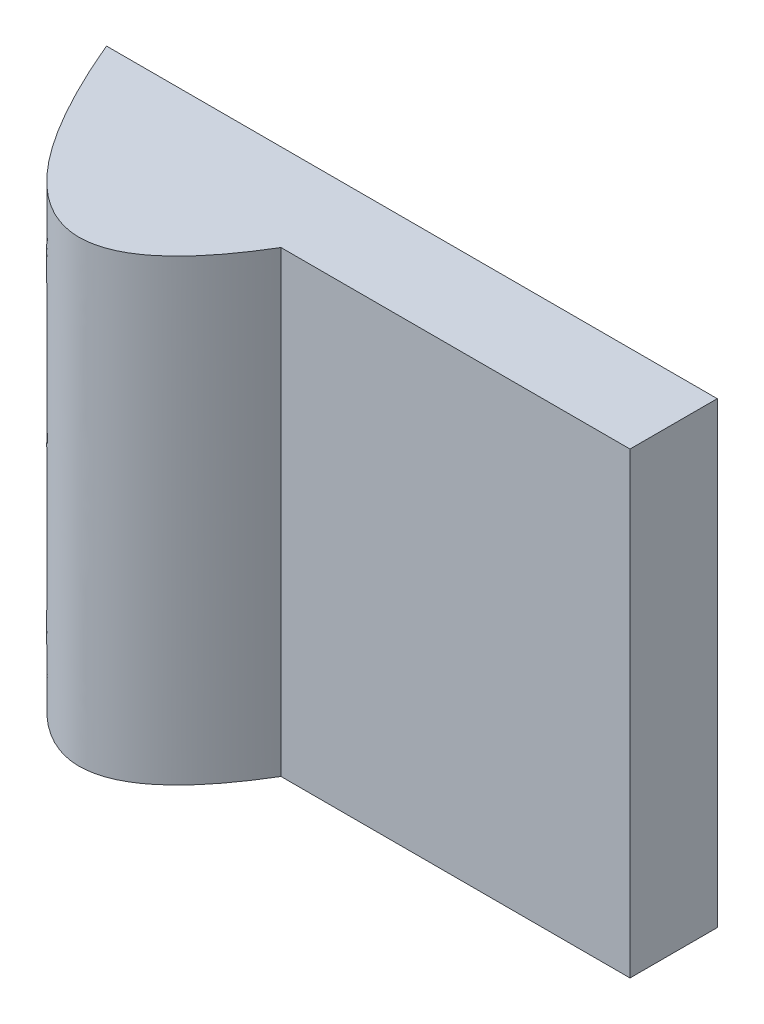
ISO-10303-21;
HEADER;
FILE_DESCRIPTION(('STEP AP214'),'2;1');
FILE_NAME('part.step','',(''),(''),'','','');
FILE_SCHEMA(('AUTOMOTIVE_DESIGN { 1 0 10303 214 1 1 1 1 }'));
ENDSEC;
DATA;
#1=APPLICATION_CONTEXT('core data for automotive mechanical design processes');
#2=APPLICATION_PROTOCOL_DEFINITION('international standard','automotive_design',2000,#1);
#3=PRODUCT_CONTEXT('',#1,'mechanical');
#4=PRODUCT('Part','Part','',(#3));
#5=PRODUCT_RELATED_PRODUCT_CATEGORY('part','',(#4));
#6=PRODUCT_DEFINITION_FORMATION('','',#4);
#7=PRODUCT_DEFINITION_CONTEXT('part definition',#1,'design');
#8=PRODUCT_DEFINITION('design','',#6,#7);
#9=PRODUCT_DEFINITION_SHAPE('','',#8);
#10=(LENGTH_UNIT() NAMED_UNIT(*) SI_UNIT(.MILLI.,.METRE.));
#11=(NAMED_UNIT(*) PLANE_ANGLE_UNIT() SI_UNIT($,.RADIAN.));
#12=(NAMED_UNIT(*) SI_UNIT($,.STERADIAN.) SOLID_ANGLE_UNIT());
#13=UNCERTAINTY_MEASURE_WITH_UNIT(LENGTH_MEASURE(1.E-05),#10,'distance_accuracy_value','');
#14=(GEOMETRIC_REPRESENTATION_CONTEXT(3) GLOBAL_UNCERTAINTY_ASSIGNED_CONTEXT((#13)) GLOBAL_UNIT_ASSIGNED_CONTEXT((#10,
#11,#12)) REPRESENTATION_CONTEXT('',''));
#15=CARTESIAN_POINT('',(0.,0.,0.));
#16=DIRECTION('',(0.,0.,1.));
#17=DIRECTION('',(1.,0.,0.));
#18=AXIS2_PLACEMENT_3D('',#15,#16,#17);
#19=CARTESIAN_POINT('',(0.,105.,-70.));
#20=DIRECTION('',(0.,0.,-1.));
#21=DIRECTION('',(-1.,0.,0.));
#22=AXIS2_PLACEMENT_3D('',#19,#20,#21);
#23=PLANE('',#22);
#24=DIRECTION('',(1.,0.,0.));
#25=VECTOR('',#24,1.);
#26=CARTESIAN_POINT('',(0.,0.,-70.));
#27=LINE('',#26,#25);
#28=CARTESIAN_POINT('',(59.9999999999999,0.,-70.));
#29=VERTEX_POINT('',#28);
#30=CARTESIAN_POINT('',(200.,0.,-70.));
#31=VERTEX_POINT('',#30);
#32=EDGE_CURVE('E227',#29,#31,#27,.T.);
#33=ORIENTED_EDGE('',*,*,#32,.F.);
#34=DIRECTION('',(0.,-1.,0.));
#35=VECTOR('',#34,1.);
#36=CARTESIAN_POINT('',(59.9999999999999,105.,-70.));
#37=LINE('',#36,#35);
#38=CARTESIAN_POINT('',(59.9999999999999,105.,-70.));
#39=VERTEX_POINT('',#38);
#40=EDGE_CURVE('E11',#39,#29,#37,.T.);
#41=ORIENTED_EDGE('',*,*,#40,.F.);
#42=DIRECTION('',(1.,0.,0.));
#43=VECTOR('',#42,1.);
#44=CARTESIAN_POINT('',(0.,105.,-70.));
#45=LINE('',#44,#43);
#46=CARTESIAN_POINT('',(200.,105.,-70.));
#47=VERTEX_POINT('',#46);
#48=EDGE_CURVE('E188',#39,#47,#45,.T.);
#49=ORIENTED_EDGE('',*,*,#48,.T.);
#50=DIRECTION('',(0.,-1.,0.));
#51=VECTOR('',#50,1.);
#52=CARTESIAN_POINT('',(200.,105.,-70.));
#53=LINE('',#52,#51);
#54=EDGE_CURVE('E70',#47,#31,#53,.T.);
#55=ORIENTED_EDGE('',*,*,#54,.T.);
#56=EDGE_LOOP('',(#33,#41,#49,#55));
#57=FACE_BOUND('',#56,.T.);
#58=ADVANCED_FACE('F41',(#57),#23,.T.);
#59=CARTESIAN_POINT('',(59.9999999999999,105.,-70.));
#60=CARTESIAN_POINT('',(89.7639468296247,105.,0.562785514085895));
#61=CARTESIAN_POINT('',(120.,105.,-50.));
#62=B_SPLINE_CURVE_WITH_KNOTS('',2,(#59,#60,#61),.UNSPECIFIED.,.F.,.F.,(3,3),(0.,1.),.UNSPECIFIED.);
#63=DIRECTION('',(0.,-1.,0.));
#64=VECTOR('',#63,1.);
#65=SURFACE_OF_LINEAR_EXTRUSION('',#62,#64);
#66=CARTESIAN_POINT('',(59.9999999999999,0.,-70.));
#67=CARTESIAN_POINT('',(89.7639468296247,0.,0.562785514085895));
#68=CARTESIAN_POINT('',(120.,0.,-50.));
#69=B_SPLINE_CURVE_WITH_KNOTS('',2,(#66,#67,#68),.UNSPECIFIED.,.F.,.F.,(3,3),(0.,1.),.UNSPECIFIED.);
#70=CARTESIAN_POINT('',(120.,0.,-50.));
#71=VERTEX_POINT('',#70);
#72=EDGE_CURVE('E231',#29,#71,#69,.T.);
#73=ORIENTED_EDGE('',*,*,#72,.T.);
#74=DIRECTION('',(0.,-1.,0.));
#75=VECTOR('',#74,1.);
#76=CARTESIAN_POINT('',(120.,105.,-50.));
#77=LINE('',#76,#75);
#78=CARTESIAN_POINT('',(120.,105.,-50.));
#79=VERTEX_POINT('',#78);
#80=EDGE_CURVE('E52',#79,#71,#77,.T.);
#81=ORIENTED_EDGE('',*,*,#80,.F.);
#82=EDGE_CURVE('E191',#39,#79,#62,.T.);
#83=ORIENTED_EDGE('',*,*,#82,.F.);
#84=ORIENTED_EDGE('',*,*,#40,.T.);
#85=EDGE_LOOP('',(#73,#81,#83,#84));
#86=FACE_BOUND('',#85,.T.);
#87=ADVANCED_FACE('F203',(#86),#65,.F.);
#88=CARTESIAN_POINT('',(0.,105.,-50.));
#89=DIRECTION('',(0.,0.,1.));
#90=DIRECTION('',(1.,0.,0.));
#91=AXIS2_PLACEMENT_3D('',#88,#89,#90);
#92=PLANE('',#91);
#93=DIRECTION('',(-1.,0.,0.));
#94=VECTOR('',#93,1.);
#95=CARTESIAN_POINT('',(0.,0.,-50.));
#96=LINE('',#95,#94);
#97=CARTESIAN_POINT('',(200.,0.,-50.));
#98=VERTEX_POINT('',#97);
#99=EDGE_CURVE('E237',#98,#71,#96,.T.);
#100=ORIENTED_EDGE('',*,*,#99,.F.);
#101=DIRECTION('',(0.,-1.,0.));
#102=VECTOR('',#101,1.);
#103=CARTESIAN_POINT('',(200.,105.,-50.));
#104=LINE('',#103,#102);
#105=CARTESIAN_POINT('',(200.,105.,-50.));
#106=VERTEX_POINT('',#105);
#107=EDGE_CURVE('E254',#106,#98,#104,.T.);
#108=ORIENTED_EDGE('',*,*,#107,.F.);
#109=DIRECTION('',(-1.,0.,0.));
#110=VECTOR('',#109,1.);
#111=CARTESIAN_POINT('',(0.,105.,-50.));
#112=LINE('',#111,#110);
#113=EDGE_CURVE('E198',#106,#79,#112,.T.);
#114=ORIENTED_EDGE('',*,*,#113,.T.);
#115=ORIENTED_EDGE('',*,*,#80,.T.);
#116=EDGE_LOOP('',(#100,#108,#114,#115));
#117=FACE_BOUND('',#116,.T.);
#118=ADVANCED_FACE('F206',(#117),#92,.T.);
#119=CARTESIAN_POINT('',(200.,105.,0.));
#120=DIRECTION('',(1.,0.,0.));
#121=DIRECTION('',(0.,0.,-1.));
#122=AXIS2_PLACEMENT_3D('',#119,#120,#121);
#123=PLANE('',#122);
#124=DIRECTION('',(0.,0.,1.));
#125=VECTOR('',#124,1.);
#126=CARTESIAN_POINT('',(200.,0.,0.));
#127=LINE('',#126,#125);
#128=EDGE_CURVE('E192',#31,#98,#127,.T.);
#129=ORIENTED_EDGE('',*,*,#128,.F.);
#130=ORIENTED_EDGE('',*,*,#54,.F.);
#131=DIRECTION('',(0.,0.,1.));
#132=VECTOR('',#131,1.);
#133=CARTESIAN_POINT('',(200.,105.,0.));
#134=LINE('',#133,#132);
#135=EDGE_CURVE('E240',#47,#106,#134,.T.);
#136=ORIENTED_EDGE('',*,*,#135,.T.);
#137=ORIENTED_EDGE('',*,*,#107,.T.);
#138=EDGE_LOOP('',(#129,#130,#136,#137));
#139=FACE_BOUND('',#138,.T.);
#140=ADVANCED_FACE('F210',(#139),#123,.T.);
#141=CARTESIAN_POINT('',(0.,105.,0.));
#142=DIRECTION('',(0.,1.,0.));
#143=DIRECTION('',(0.,0.,1.));
#144=AXIS2_PLACEMENT_3D('',#141,#142,#143);
#145=PLANE('',#144);
#146=ORIENTED_EDGE('',*,*,#48,.F.);
#147=ORIENTED_EDGE('',*,*,#82,.T.);
#148=ORIENTED_EDGE('',*,*,#113,.F.);
#149=ORIENTED_EDGE('',*,*,#135,.F.);
#150=EDGE_LOOP('',(#146,#147,#148,#149));
#151=FACE_BOUND('',#150,.T.);
#152=ADVANCED_FACE('F213',(#151),#145,.T.);
#153=CARTESIAN_POINT('',(0.,0.,0.));
#154=DIRECTION('',(0.,1.,0.));
#155=DIRECTION('',(0.,0.,1.));
#156=AXIS2_PLACEMENT_3D('',#153,#154,#155);
#157=PLANE('',#156);
#158=DIRECTION('',(1.,0.,-2.10641765325667E-13));
#159=VECTOR('',#158,1.);
#160=CARTESIAN_POINT('',(118.571731581544,0.,-52.4999999999833));
#161=LINE('',#160,#159);
#162=CARTESIAN_POINT('',(118.571731581532,0.,-52.4999999999913));
#163=VERTEX_POINT('',#162);
#164=CARTESIAN_POINT('',(197.5,0.,-52.5));
#165=VERTEX_POINT('',#164);
#166=EDGE_CURVE('E128',#163,#165,#161,.T.);
#167=ORIENTED_EDGE('',*,*,#166,.T.);
#168=DIRECTION('',(0.,0.,-1.));
#169=VECTOR('',#168,1.);
#170=CARTESIAN_POINT('',(197.5,0.,-52.5));
#171=LINE('',#170,#169);
#172=CARTESIAN_POINT('',(197.5,0.,-67.5));
#173=VERTEX_POINT('',#172);
#174=EDGE_CURVE('E119',#165,#173,#171,.T.);
#175=ORIENTED_EDGE('',*,*,#174,.T.);
#176=DIRECTION('',(-1.,0.,0.));
#177=VECTOR('',#176,1.);
#178=CARTESIAN_POINT('',(197.5,0.,-67.5));
#179=LINE('',#178,#177);
#180=CARTESIAN_POINT('',(63.8007796486189,0.,-67.4999999999995));
#181=VERTEX_POINT('',#180);
#182=EDGE_CURVE('E131',#173,#181,#179,.T.);
#183=ORIENTED_EDGE('',*,*,#182,.T.);
#184=CARTESIAN_POINT('',(118.571731581532,0.,-52.4999999999913));
#185=CARTESIAN_POINT('',(117.700689072234,0.,-51.0013659075484));
#186=CARTESIAN_POINT('',(116.797531301888,0.,-49.5232047280209));
#187=CARTESIAN_POINT('',(114.908562721405,0.,-46.6195722251489));
#188=CARTESIAN_POINT('',(113.920848072441,0.,-45.191271588309));
#189=CARTESIAN_POINT('',(111.847843607642,0.,-42.4238551953792));
#190=CARTESIAN_POINT('',(110.762764430003,0.,-41.0837436654712));
#191=CARTESIAN_POINT('',(108.455990570882,0.,-38.5261298091099));
#192=CARTESIAN_POINT('',(107.235485200437,0.,-37.3075601039551));
#193=CARTESIAN_POINT('',(105.577699644215,0.,-35.9029529404592));
#194=CARTESIAN_POINT('',(105.238639259198,0.,-35.6275599185483));
#195=CARTESIAN_POINT('',(104.550679955083,0.,-35.0949941671792));
#196=CARTESIAN_POINT('',(104.201442555354,0.,-34.8374813269087));
#197=CARTESIAN_POINT('',(103.136178711405,0.,-34.0942193244457));
#198=CARTESIAN_POINT('',(102.402774126846,0.,-33.6374572715118));
#199=CARTESIAN_POINT('',(101.258207725243,0.,-33.0264736290222));
#200=CARTESIAN_POINT('',(100.86923742211,0.,-32.8352361202778));
#201=CARTESIAN_POINT('',(100.074177189102,0.,-32.4813170058469));
#202=CARTESIAN_POINT('',(99.6661939366149,0.,-32.318036142523));
#203=CARTESIAN_POINT('',(98.4310313274661,0.,-31.8841739025251));
#204=CARTESIAN_POINT('',(97.5914115130016,0.,-31.6681420071057));
#205=CARTESIAN_POINT('',(96.3036988695407,0.,-31.4720810428203));
#206=CARTESIAN_POINT('',(95.8691192852659,0.,-31.4280646251062));
#207=CARTESIAN_POINT('',(94.9923433063451,0.,-31.3862265177101));
#208=CARTESIAN_POINT('',(94.5567845764144,0.,-31.388668969988));
#209=CARTESIAN_POINT('',(93.2582870437722,0.,-31.4635283950751));
#210=CARTESIAN_POINT('',(92.4035308194527,0.,-31.6035098143176));
#211=CARTESIAN_POINT('',(91.1363690074252,0.,-31.9371117182441));
#212=CARTESIAN_POINT('',(90.7171674861406,0.,-32.0689844590564));
#213=CARTESIAN_POINT('',(89.9011279966838,0.,-32.364288721269));
#214=CARTESIAN_POINT('',(89.5018252306602,0.,-32.5283130391553));
#215=CARTESIAN_POINT('',(88.3267309185229,0.,-33.0632351097313));
#216=CARTESIAN_POINT('',(87.5736003318513,0.,-33.4766945656551));
#217=CARTESIAN_POINT('',(86.114894928821,0.,-34.3929324928798));
#218=CARTESIAN_POINT('',(85.4075274457681,0.,-34.8973321217045));
#219=CARTESIAN_POINT('',(84.0400386303843,0.,-35.9724439482684));
#220=CARTESIAN_POINT('',(83.3842160470672,0.,-36.5393965587148));
#221=CARTESIAN_POINT('',(82.1163539797221,0.,-37.7193975680936));
#222=CARTESIAN_POINT('',(81.5043848447922,0.,-38.3325200320697));
#223=CARTESIAN_POINT('',(80.3161767981669,0.,-39.5963825074271));
#224=CARTESIAN_POINT('',(79.7389025536571,0.,-40.2485391840518));
#225=CARTESIAN_POINT('',(78.0663360240674,0.,-42.2345746306917));
#226=CARTESIAN_POINT('',(77.0249010291279,0.,-43.601867811771));
#227=CARTESIAN_POINT('',(75.0438003313227,0.,-46.3962768863662));
#228=CARTESIAN_POINT('',(74.1046403958391,0.,-47.8236900834793));
#229=CARTESIAN_POINT('',(71.4022288268472,0.,-52.1735698632781));
#230=CARTESIAN_POINT('',(69.7521328059089,0.,-55.1625523422327));
#231=CARTESIAN_POINT('',(66.644103155749,0.,-61.2534754948678));
#232=CARTESIAN_POINT('',(65.1878369101097,0.,-64.3563963012252));
#233=CARTESIAN_POINT('',(63.8007796486189,0.,-67.4999999999995));
#234=B_SPLINE_CURVE_WITH_KNOTS('',3,(#184,#185,#186,#187,#188,#189,#190,#191,#192,#193,#194,
#195,#196,#197,#198,#199,#200,#201,#202,#203,#204,#205,#206,#207,#208,#209,#210,#211,#212,#213,
#214,#215,#216,#217,#218,#219,#220,#221,#222,#223,#224,#225,#226,#227,#228,#229,#230,#231,#232,
#233),.UNSPECIFIED.,.F.,.F.,(4,2,2,2,2,2,2,2,2,2,2,2,2,2,2,2,2,2,2,2,2,2,2,2,4),(0.,
0.0624999999999992,0.124999999999998,0.187499999999998,0.249999999999997,0.265624999999997,
0.281249999999996,0.312499999999996,0.328124999999996,0.343749999999995,0.374999999999995,
0.390624999999995,0.406249999999995,0.437499999999994,0.453124999999994,0.468749999999995,
0.499999999999995,0.531249999999995,0.562499999999995,0.593749999999996,0.624999999999996,
0.687499999999996,0.749999999999997,0.874999999999999,1.),.UNSPECIFIED.);
#235=EDGE_CURVE('E60',#181,#163,#234,.F.);
#236=ORIENTED_EDGE('',*,*,#235,.T.);
#237=EDGE_LOOP('',(#167,#175,#183,#236));
#238=FACE_BOUND('',#237,.T.);
#239=ORIENTED_EDGE('',*,*,#32,.T.);
#240=ORIENTED_EDGE('',*,*,#128,.T.);
#241=ORIENTED_EDGE('',*,*,#99,.T.);
#242=ORIENTED_EDGE('',*,*,#72,.F.);
#243=EDGE_LOOP('',(#239,#240,#241,#242));
#244=FACE_BOUND('',#243,.T.);
#245=ADVANCED_FACE('F136',(#238,#244),#157,.F.);
#246=CARTESIAN_POINT('',(197.5,0.,-52.5));
#247=DIRECTION('',(1.,0.,0.));
#248=DIRECTION('',(0.,0.,-1.));
#249=AXIS2_PLACEMENT_3D('',#246,#247,#248);
#250=PLANE('',#249);
#251=DIRECTION('',(0.,0.,-1.));
#252=VECTOR('',#251,1.);
#253=CARTESIAN_POINT('',(197.5,102.5,-52.5));
#254=LINE('',#253,#252);
#255=CARTESIAN_POINT('',(197.5,102.5,-52.5));
#256=VERTEX_POINT('',#255);
#257=CARTESIAN_POINT('',(197.5,102.5,-67.5));
#258=VERTEX_POINT('',#257);
#259=EDGE_CURVE('E122',#256,#258,#254,.T.);
#260=ORIENTED_EDGE('',*,*,#259,.T.);
#261=DIRECTION('',(0.,1.,0.));
#262=VECTOR('',#261,1.);
#263=CARTESIAN_POINT('',(197.5,0.,-67.5));
#264=LINE('',#263,#262);
#265=EDGE_CURVE('E115',#173,#258,#264,.T.);
#266=ORIENTED_EDGE('',*,*,#265,.F.);
#267=ORIENTED_EDGE('',*,*,#174,.F.);
#268=DIRECTION('',(0.,1.,0.));
#269=VECTOR('',#268,1.);
#270=CARTESIAN_POINT('',(197.5,0.,-52.5));
#271=LINE('',#270,#269);
#272=EDGE_CURVE('E232',#165,#256,#271,.T.);
#273=ORIENTED_EDGE('',*,*,#272,.T.);
#274=EDGE_LOOP('',(#260,#266,#267,#273));
#275=FACE_BOUND('',#274,.T.);
#276=ADVANCED_FACE('F117',(#275),#250,.F.);
#277=CARTESIAN_POINT('',(118.571731581544,0.,-52.4999999999833));
#278=DIRECTION('',(2.10641765325667E-13,0.,1.));
#279=DIRECTION('',(1.,0.,-2.10641765325667E-13));
#280=AXIS2_PLACEMENT_3D('',#277,#278,#279);
#281=PLANE('',#280);
#282=DIRECTION('',(1.,0.,-2.10641765325667E-13));
#283=VECTOR('',#282,1.);
#284=CARTESIAN_POINT('',(118.571731581544,102.5,-52.4999999999833));
#285=LINE('',#284,#283);
#286=CARTESIAN_POINT('',(118.571731581532,102.5,-52.4999999999913));
#287=VERTEX_POINT('',#286);
#288=EDGE_CURVE('E140',#287,#256,#285,.T.);
#289=ORIENTED_EDGE('',*,*,#288,.T.);
#290=ORIENTED_EDGE('',*,*,#272,.F.);
#291=ORIENTED_EDGE('',*,*,#166,.F.);
#292=DIRECTION('',(0.,1.,0.));
#293=VECTOR('',#292,1.);
#294=CARTESIAN_POINT('',(118.571731581532,0.,-52.4999999999913));
#295=LINE('',#294,#293);
#296=EDGE_CURVE('E239',#163,#287,#295,.T.);
#297=ORIENTED_EDGE('',*,*,#296,.T.);
#298=EDGE_LOOP('',(#289,#290,#291,#297));
#299=FACE_BOUND('',#298,.T.);
#300=ADVANCED_FACE('F161',(#299),#281,.F.);
#301=CARTESIAN_POINT('',(63.8007796486189,0.,-67.4999999999995));
#302=CARTESIAN_POINT('',(65.1878369101097,0.,-64.3563963012252));
#303=CARTESIAN_POINT('',(66.644103155749,0.,-61.2534754948678));
#304=CARTESIAN_POINT('',(69.7521328059089,0.,-55.1625523422327));
#305=CARTESIAN_POINT('',(71.4022288268472,0.,-52.1735698632781));
#306=CARTESIAN_POINT('',(74.1046403958391,0.,-47.8236900834793));
#307=CARTESIAN_POINT('',(75.0438003313227,0.,-46.3962768863662));
#308=CARTESIAN_POINT('',(77.0249010291279,0.,-43.601867811771));
#309=CARTESIAN_POINT('',(78.0663360240674,0.,-42.2345746306917));
#310=CARTESIAN_POINT('',(79.7389025536571,0.,-40.2485391840518));
#311=CARTESIAN_POINT('',(80.3161767981669,0.,-39.5963825074271));
#312=CARTESIAN_POINT('',(81.5043848447922,0.,-38.3325200320697));
#313=CARTESIAN_POINT('',(82.1163539797221,0.,-37.7193975680936));
#314=CARTESIAN_POINT('',(83.3842160470672,0.,-36.5393965587148));
#315=CARTESIAN_POINT('',(84.0400386303843,0.,-35.9724439482684));
#316=CARTESIAN_POINT('',(85.4075274457681,0.,-34.8973321217045));
#317=CARTESIAN_POINT('',(86.114894928821,0.,-34.3929324928798));
#318=CARTESIAN_POINT('',(87.5736003318513,0.,-33.4766945656551));
#319=CARTESIAN_POINT('',(88.3267309185229,0.,-33.0632351097313));
#320=CARTESIAN_POINT('',(89.5018252306602,0.,-32.5283130391553));
#321=CARTESIAN_POINT('',(89.9011279966838,0.,-32.364288721269));
#322=CARTESIAN_POINT('',(90.7171674861406,0.,-32.0689844590564));
#323=CARTESIAN_POINT('',(91.1363690074252,0.,-31.9371117182441));
#324=CARTESIAN_POINT('',(92.4035308194527,0.,-31.6035098143176));
#325=CARTESIAN_POINT('',(93.2582870437722,0.,-31.4635283950751));
#326=CARTESIAN_POINT('',(94.5567845764144,0.,-31.388668969988));
#327=CARTESIAN_POINT('',(94.9923433063451,0.,-31.3862265177101));
#328=CARTESIAN_POINT('',(95.8691192852659,0.,-31.4280646251062));
#329=CARTESIAN_POINT('',(96.3036988695407,0.,-31.4720810428203));
#330=CARTESIAN_POINT('',(97.5914115130016,0.,-31.6681420071057));
#331=CARTESIAN_POINT('',(98.4310313274661,0.,-31.8841739025251));
#332=CARTESIAN_POINT('',(99.6661939366149,0.,-32.318036142523));
#333=CARTESIAN_POINT('',(100.074177189102,0.,-32.4813170058469));
#334=CARTESIAN_POINT('',(100.86923742211,0.,-32.8352361202778));
#335=CARTESIAN_POINT('',(101.258207725243,0.,-33.0264736290222));
#336=CARTESIAN_POINT('',(102.402774126846,0.,-33.6374572715118));
#337=CARTESIAN_POINT('',(103.136178711405,0.,-34.0942193244457));
#338=CARTESIAN_POINT('',(104.201442555354,0.,-34.8374813269087));
#339=CARTESIAN_POINT('',(104.550679955083,0.,-35.0949941671792));
#340=CARTESIAN_POINT('',(105.238639259198,0.,-35.6275599185483));
#341=CARTESIAN_POINT('',(105.577699644215,0.,-35.9029529404592));
#342=CARTESIAN_POINT('',(107.235485200437,0.,-37.3075601039551));
#343=CARTESIAN_POINT('',(108.455990570882,0.,-38.5261298091099));
#344=CARTESIAN_POINT('',(110.762764430003,0.,-41.0837436654712));
#345=CARTESIAN_POINT('',(111.847843607642,0.,-42.4238551953792));
#346=CARTESIAN_POINT('',(113.920848072441,0.,-45.191271588309));
#347=CARTESIAN_POINT('',(114.908562721405,0.,-46.6195722251489));
#348=CARTESIAN_POINT('',(116.797531301888,0.,-49.5232047280209));
#349=CARTESIAN_POINT('',(117.700689072234,0.,-51.0013659075484));
#350=CARTESIAN_POINT('',(118.571731581532,0.,-52.4999999999913));
#351=B_SPLINE_CURVE_WITH_KNOTS('',3,(#301,#302,#303,#304,#305,#306,#307,#308,#309,#310,#311,
#312,#313,#314,#315,#316,#317,#318,#319,#320,#321,#322,#323,#324,#325,#326,#327,#328,#329,#330,
#331,#332,#333,#334,#335,#336,#337,#338,#339,#340,#341,#342,#343,#344,#345,#346,#347,#348,#349,
#350),.UNSPECIFIED.,.F.,.F.,(4,2,2,2,2,2,2,2,2,2,2,2,2,2,2,2,2,2,2,2,2,2,2,2,4),(0.,
0.125000000000001,0.250000000000003,0.312500000000004,0.375000000000004,0.406250000000004,
0.437500000000005,0.468750000000005,0.500000000000005,0.531250000000005,0.546875000000006,
0.562500000000006,0.593750000000005,0.609375000000005,0.625000000000005,0.656250000000005,
0.671875000000004,0.687500000000004,0.718750000000004,0.734375000000003,0.750000000000003,
0.812500000000002,0.875000000000002,0.937500000000001,1.),.UNSPECIFIED.);
#352=DIRECTION('',(0.,1.,0.));
#353=VECTOR('',#352,1.);
#354=SURFACE_OF_LINEAR_EXTRUSION('',#351,#353);
#355=CARTESIAN_POINT('',(63.8007796486189,102.5,-67.4999999999995));
#356=CARTESIAN_POINT('',(65.1878369101097,102.5,-64.3563963012252));
#357=CARTESIAN_POINT('',(66.644103155749,102.5,-61.2534754948678));
#358=CARTESIAN_POINT('',(69.7521328059089,102.5,-55.1625523422327));
#359=CARTESIAN_POINT('',(71.4022288268472,102.5,-52.1735698632781));
#360=CARTESIAN_POINT('',(74.1046403958391,102.5,-47.8236900834793));
#361=CARTESIAN_POINT('',(75.0438003313227,102.5,-46.3962768863662));
#362=CARTESIAN_POINT('',(77.0249010291279,102.5,-43.601867811771));
#363=CARTESIAN_POINT('',(78.0663360240674,102.5,-42.2345746306917));
#364=CARTESIAN_POINT('',(79.7389025536571,102.5,-40.2485391840518));
#365=CARTESIAN_POINT('',(80.3161767981669,102.5,-39.5963825074271));
#366=CARTESIAN_POINT('',(81.5043848447922,102.5,-38.3325200320697));
#367=CARTESIAN_POINT('',(82.1163539797221,102.5,-37.7193975680936));
#368=CARTESIAN_POINT('',(83.3842160470672,102.5,-36.5393965587148));
#369=CARTESIAN_POINT('',(84.0400386303843,102.5,-35.9724439482684));
#370=CARTESIAN_POINT('',(85.4075274457681,102.5,-34.8973321217045));
#371=CARTESIAN_POINT('',(86.114894928821,102.5,-34.3929324928798));
#372=CARTESIAN_POINT('',(87.5736003318513,102.5,-33.4766945656551));
#373=CARTESIAN_POINT('',(88.3267309185229,102.5,-33.0632351097313));
#374=CARTESIAN_POINT('',(89.5018252306602,102.5,-32.5283130391553));
#375=CARTESIAN_POINT('',(89.9011279966838,102.5,-32.364288721269));
#376=CARTESIAN_POINT('',(90.7171674861406,102.5,-32.0689844590564));
#377=CARTESIAN_POINT('',(91.1363690074252,102.5,-31.9371117182441));
#378=CARTESIAN_POINT('',(92.4035308194527,102.5,-31.6035098143176));
#379=CARTESIAN_POINT('',(93.2582870437722,102.5,-31.4635283950751));
#380=CARTESIAN_POINT('',(94.5567845764144,102.5,-31.388668969988));
#381=CARTESIAN_POINT('',(94.9923433063451,102.5,-31.3862265177101));
#382=CARTESIAN_POINT('',(95.8691192852659,102.5,-31.4280646251062));
#383=CARTESIAN_POINT('',(96.3036988695407,102.5,-31.4720810428203));
#384=CARTESIAN_POINT('',(97.5914115130016,102.5,-31.6681420071057));
#385=CARTESIAN_POINT('',(98.4310313274661,102.5,-31.8841739025251));
#386=CARTESIAN_POINT('',(99.6661939366149,102.5,-32.318036142523));
#387=CARTESIAN_POINT('',(100.074177189102,102.5,-32.4813170058469));
#388=CARTESIAN_POINT('',(100.86923742211,102.5,-32.8352361202778));
#389=CARTESIAN_POINT('',(101.258207725243,102.5,-33.0264736290222));
#390=CARTESIAN_POINT('',(102.402774126846,102.5,-33.6374572715118));
#391=CARTESIAN_POINT('',(103.136178711405,102.5,-34.0942193244457));
#392=CARTESIAN_POINT('',(104.201442555354,102.5,-34.8374813269087));
#393=CARTESIAN_POINT('',(104.550679955083,102.5,-35.0949941671792));
#394=CARTESIAN_POINT('',(105.238639259198,102.5,-35.6275599185483));
#395=CARTESIAN_POINT('',(105.577699644215,102.5,-35.9029529404592));
#396=CARTESIAN_POINT('',(107.235485200437,102.5,-37.3075601039551));
#397=CARTESIAN_POINT('',(108.455990570882,102.5,-38.5261298091099));
#398=CARTESIAN_POINT('',(110.762764430003,102.5,-41.0837436654712));
#399=CARTESIAN_POINT('',(111.847843607642,102.5,-42.4238551953792));
#400=CARTESIAN_POINT('',(113.920848072441,102.5,-45.191271588309));
#401=CARTESIAN_POINT('',(114.908562721405,102.5,-46.6195722251489));
#402=CARTESIAN_POINT('',(116.797531301888,102.5,-49.5232047280209));
#403=CARTESIAN_POINT('',(117.700689072234,102.5,-51.0013659075484));
#404=CARTESIAN_POINT('',(118.571731581532,102.5,-52.4999999999913));
#405=B_SPLINE_CURVE_WITH_KNOTS('',3,(#355,#356,#357,#358,#359,#360,#361,#362,#363,#364,#365,
#366,#367,#368,#369,#370,#371,#372,#373,#374,#375,#376,#377,#378,#379,#380,#381,#382,#383,#384,
#385,#386,#387,#388,#389,#390,#391,#392,#393,#394,#395,#396,#397,#398,#399,#400,#401,#402,#403,
#404),.UNSPECIFIED.,.F.,.F.,(4,2,2,2,2,2,2,2,2,2,2,2,2,2,2,2,2,2,2,2,2,2,2,2,4),(0.,
0.125000000000001,0.250000000000003,0.312500000000004,0.375000000000004,0.406250000000004,
0.437500000000005,0.468750000000005,0.500000000000005,0.531250000000005,0.546875000000006,
0.562500000000006,0.593750000000005,0.609375000000005,0.625000000000005,0.656250000000005,
0.671875000000004,0.687500000000004,0.718750000000004,0.734375000000003,0.750000000000003,
0.812500000000002,0.875000000000002,0.937500000000001,1.),.UNSPECIFIED.);
#406=CARTESIAN_POINT('',(63.8007796486189,102.5,-67.4999999999995));
#407=VERTEX_POINT('',#406);
#408=EDGE_CURVE('E144',#407,#287,#405,.T.);
#409=ORIENTED_EDGE('',*,*,#408,.T.);
#410=ORIENTED_EDGE('',*,*,#296,.F.);
#411=ORIENTED_EDGE('',*,*,#235,.F.);
#412=DIRECTION('',(0.,1.,0.));
#413=VECTOR('',#412,1.);
#414=CARTESIAN_POINT('',(63.8007796486189,0.,-67.4999999999995));
#415=LINE('',#414,#413);
#416=EDGE_CURVE('E127',#181,#407,#415,.T.);
#417=ORIENTED_EDGE('',*,*,#416,.T.);
#418=EDGE_LOOP('',(#409,#410,#411,#417));
#419=FACE_BOUND('',#418,.T.);
#420=ADVANCED_FACE('F156',(#419),#354,.F.);
#421=CARTESIAN_POINT('',(197.5,0.,-67.5));
#422=DIRECTION('',(0.,0.,-1.));
#423=DIRECTION('',(-1.,0.,0.));
#424=AXIS2_PLACEMENT_3D('',#421,#422,#423);
#425=PLANE('',#424);
#426=DIRECTION('',(-1.,0.,0.));
#427=VECTOR('',#426,1.);
#428=CARTESIAN_POINT('',(197.5,102.5,-67.5));
#429=LINE('',#428,#427);
#430=EDGE_CURVE('E176',#258,#407,#429,.T.);
#431=ORIENTED_EDGE('',*,*,#430,.T.);
#432=ORIENTED_EDGE('',*,*,#416,.F.);
#433=ORIENTED_EDGE('',*,*,#182,.F.);
#434=ORIENTED_EDGE('',*,*,#265,.T.);
#435=EDGE_LOOP('',(#431,#432,#433,#434));
#436=FACE_BOUND('',#435,.T.);
#437=ADVANCED_FACE('F132',(#436),#425,.F.);
#438=CARTESIAN_POINT('',(86.8442476303358,102.5,-33.9348135292676));
#439=DIRECTION('',(0.,-1.,0.));
#440=DIRECTION('',(0.,0.,-1.));
#441=AXIS2_PLACEMENT_3D('',#438,#439,#440);
#442=PLANE('',#441);
#443=ORIENTED_EDGE('',*,*,#259,.F.);
#444=ORIENTED_EDGE('',*,*,#288,.F.);
#445=ORIENTED_EDGE('',*,*,#408,.F.);
#446=ORIENTED_EDGE('',*,*,#430,.F.);
#447=EDGE_LOOP('',(#443,#444,#445,#446));
#448=FACE_BOUND('',#447,.T.);
#449=ADVANCED_FACE('F272',(#448),#442,.T.);
#450=CLOSED_SHELL('',(#58,#87,#118,#140,#152,#245,#276,#300,#420,#437,#449));
#451=MANIFOLD_SOLID_BREP('B2',#450);
#452=ADVANCED_BREP_SHAPE_REPRESENTATION('',(#18,#451),#14);
#453=SHAPE_DEFINITION_REPRESENTATION(#9,#452);
ENDSEC;
END-ISO-10303-21;
